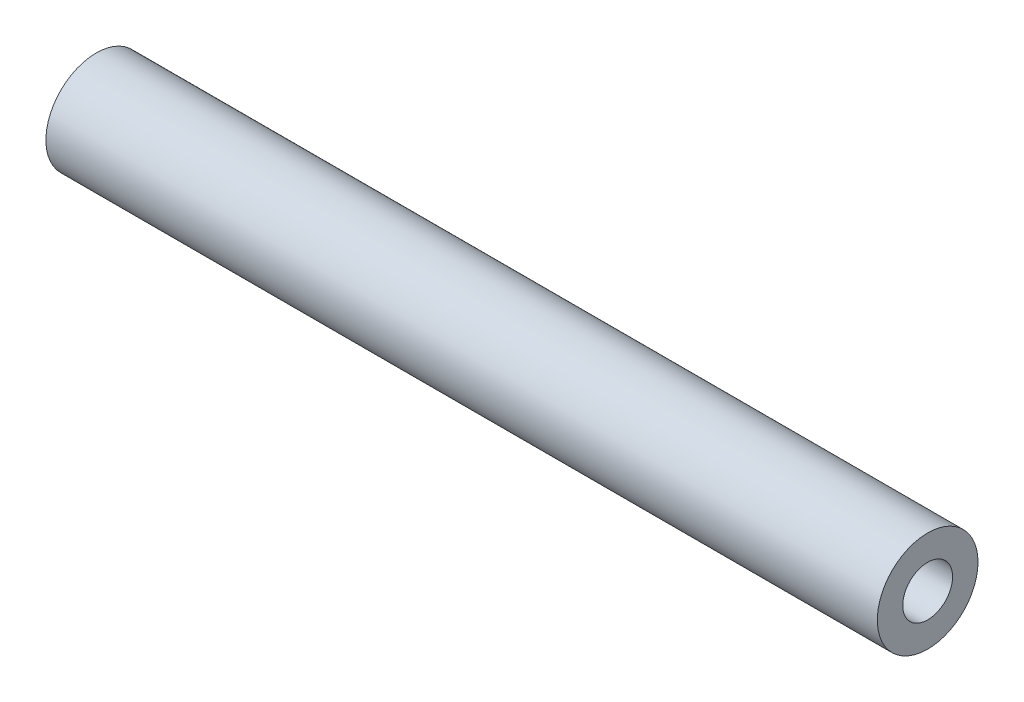
ISO-10303-21;
HEADER;
FILE_DESCRIPTION(('STEP AP214'),'2;1');
FILE_NAME('part.step','',(''),(''),'','','');
FILE_SCHEMA(('AUTOMOTIVE_DESIGN { 1 0 10303 214 1 1 1 1 }'));
ENDSEC;
DATA;
#1=APPLICATION_CONTEXT('core data for automotive mechanical design processes');
#2=APPLICATION_PROTOCOL_DEFINITION('international standard','automotive_design',2000,#1);
#3=PRODUCT_CONTEXT('',#1,'mechanical');
#4=PRODUCT('Part','Part','',(#3));
#5=PRODUCT_RELATED_PRODUCT_CATEGORY('part','',(#4));
#6=PRODUCT_DEFINITION_FORMATION('','',#4);
#7=PRODUCT_DEFINITION_CONTEXT('part definition',#1,'design');
#8=PRODUCT_DEFINITION('design','',#6,#7);
#9=PRODUCT_DEFINITION_SHAPE('','',#8);
#10=(LENGTH_UNIT() NAMED_UNIT(*) SI_UNIT(.MILLI.,.METRE.));
#11=(NAMED_UNIT(*) PLANE_ANGLE_UNIT() SI_UNIT($,.RADIAN.));
#12=(NAMED_UNIT(*) SI_UNIT($,.STERADIAN.) SOLID_ANGLE_UNIT());
#13=UNCERTAINTY_MEASURE_WITH_UNIT(LENGTH_MEASURE(1.E-05),#10,'distance_accuracy_value','');
#14=(GEOMETRIC_REPRESENTATION_CONTEXT(3) GLOBAL_UNCERTAINTY_ASSIGNED_CONTEXT((#13)) GLOBAL_UNIT_ASSIGNED_CONTEXT((#10,
#11,#12)) REPRESENTATION_CONTEXT('',''));
#15=CARTESIAN_POINT('',(0.,0.,0.));
#16=DIRECTION('',(0.,0.,1.));
#17=DIRECTION('',(1.,0.,0.));
#18=AXIS2_PLACEMENT_3D('',#15,#16,#17);
#19=CARTESIAN_POINT('',(500.,-0.647349452937221,3.3974667745607));
#20=DIRECTION('',(1.,0.,0.));
#21=DIRECTION('',(0.,0.,-1.));
#22=AXIS2_PLACEMENT_3D('',#19,#20,#21);
#23=PLANE('',#22);
#24=CARTESIAN_POINT('',(500.,-0.647349452937221,3.3974667745607));
#25=DIRECTION('',(1.,0.,0.));
#26=DIRECTION('',(0.,0.,-1.));
#27=AXIS2_PLACEMENT_3D('',#24,#25,#26);
#28=CIRCLE('',#27,30.275);
#29=CARTESIAN_POINT('',(500.,-0.647349452937221,-26.8775332254393));
#30=VERTEX_POINT('',#29);
#31=EDGE_CURVE('E10',#30,#30,#28,.T.);
#32=ORIENTED_EDGE('',*,*,#31,.T.);
#33=EDGE_LOOP('',(#32));
#34=FACE_BOUND('',#33,.T.);
#35=CARTESIAN_POINT('',(500.,-0.647349452937221,3.3974667745607));
#36=DIRECTION('',(1.,0.,0.));
#37=DIRECTION('',(0.,0.,-1.));
#38=AXIS2_PLACEMENT_3D('',#35,#36,#37);
#39=CIRCLE('',#38,15.);
#40=CARTESIAN_POINT('',(500.,-0.647349452937221,-11.6025332254393));
#41=VERTEX_POINT('',#40);
#42=EDGE_CURVE('E43',#41,#41,#39,.T.);
#43=ORIENTED_EDGE('',*,*,#42,.F.);
#44=EDGE_LOOP('',(#43));
#45=FACE_BOUND('',#44,.T.);
#46=ADVANCED_FACE('F32',(#34,#45),#23,.T.);
#47=CARTESIAN_POINT('',(0.,-0.647349452937221,3.3974667745607));
#48=DIRECTION('',(1.,0.,0.));
#49=DIRECTION('',(0.,0.,-1.));
#50=AXIS2_PLACEMENT_3D('',#47,#48,#49);
#51=PLANE('',#50);
#52=CARTESIAN_POINT('',(0.,-0.647349452937221,3.3974667745607));
#53=DIRECTION('',(1.,0.,0.));
#54=DIRECTION('',(0.,0.,-1.));
#55=AXIS2_PLACEMENT_3D('',#52,#53,#54);
#56=CIRCLE('',#55,30.275);
#57=CARTESIAN_POINT('',(0.,-0.647349452937221,-26.8775332254393));
#58=VERTEX_POINT('',#57);
#59=EDGE_CURVE('E36',#58,#58,#56,.T.);
#60=ORIENTED_EDGE('',*,*,#59,.F.);
#61=EDGE_LOOP('',(#60));
#62=FACE_BOUND('',#61,.T.);
#63=CARTESIAN_POINT('',(0.,-0.647349452937221,3.3974667745607));
#64=DIRECTION('',(1.,0.,0.));
#65=DIRECTION('',(0.,0.,-1.));
#66=AXIS2_PLACEMENT_3D('',#63,#64,#65);
#67=CIRCLE('',#66,15.);
#68=CARTESIAN_POINT('',(0.,-0.647349452937221,-11.6025332254393));
#69=VERTEX_POINT('',#68);
#70=EDGE_CURVE('E45',#69,#69,#67,.T.);
#71=ORIENTED_EDGE('',*,*,#70,.T.);
#72=EDGE_LOOP('',(#71));
#73=FACE_BOUND('',#72,.T.);
#74=ADVANCED_FACE('F55',(#62,#73),#51,.F.);
#75=CARTESIAN_POINT('',(500.,-0.647349452937221,3.3974667745607));
#76=DIRECTION('',(-1.,0.,0.));
#77=DIRECTION('',(0.,0.,1.));
#78=AXIS2_PLACEMENT_3D('',#75,#76,#77);
#79=CYLINDRICAL_SURFACE('',#78,30.275);
#80=ORIENTED_EDGE('',*,*,#31,.F.);
#81=EDGE_LOOP('',(#80));
#82=FACE_BOUND('',#81,.T.);
#83=ORIENTED_EDGE('',*,*,#59,.T.);
#84=EDGE_LOOP('',(#83));
#85=FACE_BOUND('',#84,.T.);
#86=ADVANCED_FACE('F34',(#82,#85),#79,.T.);
#87=CARTESIAN_POINT('',(500.,-0.647349452937221,3.3974667745607));
#88=DIRECTION('',(-1.,0.,0.));
#89=DIRECTION('',(0.,0.,1.));
#90=AXIS2_PLACEMENT_3D('',#87,#88,#89);
#91=CYLINDRICAL_SURFACE('',#90,15.);
#92=ORIENTED_EDGE('',*,*,#42,.T.);
#93=EDGE_LOOP('',(#92));
#94=FACE_BOUND('',#93,.T.);
#95=ORIENTED_EDGE('',*,*,#70,.F.);
#96=EDGE_LOOP('',(#95));
#97=FACE_BOUND('',#96,.T.);
#98=ADVANCED_FACE('F51',(#94,#97),#91,.F.);
#99=CLOSED_SHELL('',(#46,#74,#86,#98));
#100=MANIFOLD_SOLID_BREP('B2',#99);
#101=ADVANCED_BREP_SHAPE_REPRESENTATION('',(#18,#100),#14);
#102=SHAPE_DEFINITION_REPRESENTATION(#9,#101);
ENDSEC;
END-ISO-10303-21;
